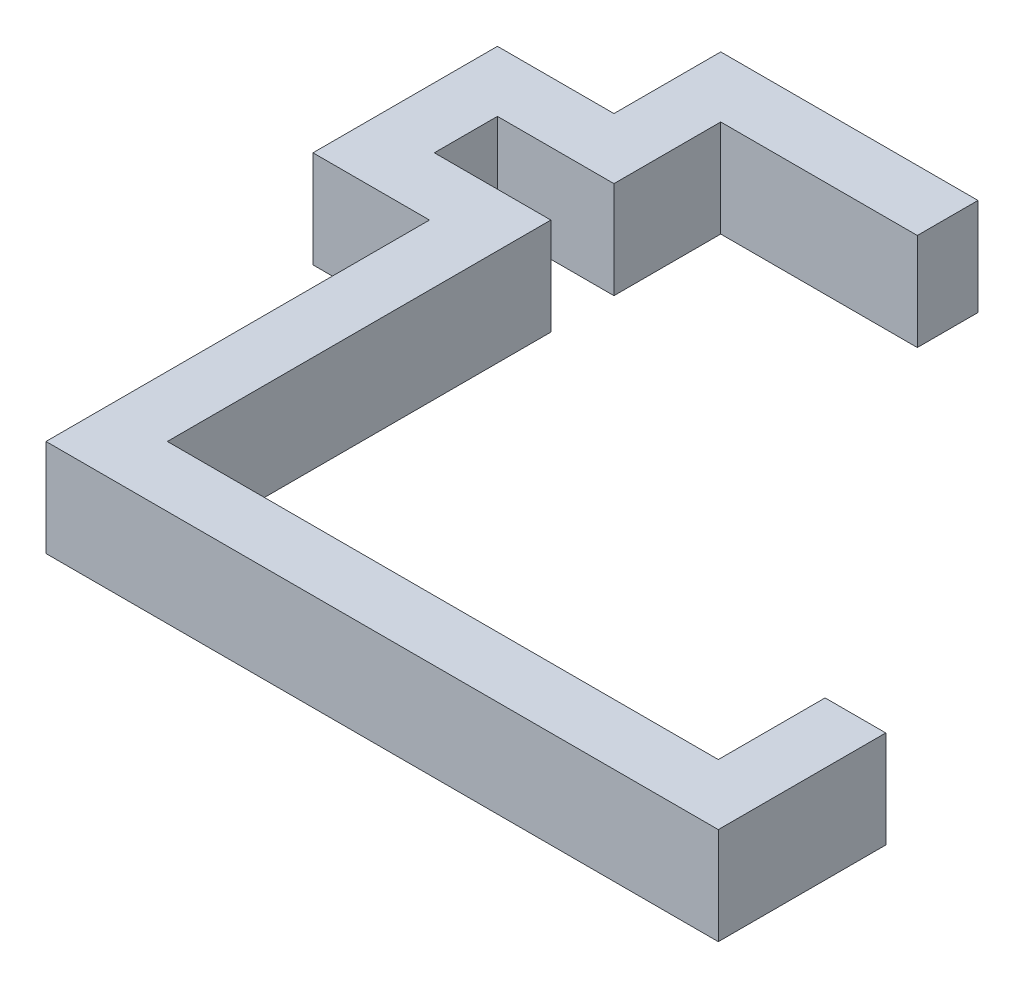
ISO-10303-21;
HEADER;
FILE_DESCRIPTION(('STEP AP214'),'2;1');
FILE_NAME('part.step','',(''),(''),'','','');
FILE_SCHEMA(('AUTOMOTIVE_DESIGN { 1 0 10303 214 1 1 1 1 }'));
ENDSEC;
DATA;
#1=APPLICATION_CONTEXT('core data for automotive mechanical design processes');
#2=APPLICATION_PROTOCOL_DEFINITION('international standard','automotive_design',2000,#1);
#3=PRODUCT_CONTEXT('',#1,'mechanical');
#4=PRODUCT('Part','Part','',(#3));
#5=PRODUCT_RELATED_PRODUCT_CATEGORY('part','',(#4));
#6=PRODUCT_DEFINITION_FORMATION('','',#4);
#7=PRODUCT_DEFINITION_CONTEXT('part definition',#1,'design');
#8=PRODUCT_DEFINITION('design','',#6,#7);
#9=PRODUCT_DEFINITION_SHAPE('','',#8);
#10=(LENGTH_UNIT() NAMED_UNIT(*) SI_UNIT(.MILLI.,.METRE.));
#11=(NAMED_UNIT(*) PLANE_ANGLE_UNIT() SI_UNIT($,.RADIAN.));
#12=(NAMED_UNIT(*) SI_UNIT($,.STERADIAN.) SOLID_ANGLE_UNIT());
#13=UNCERTAINTY_MEASURE_WITH_UNIT(LENGTH_MEASURE(1.E-05),#10,'distance_accuracy_value','');
#14=(GEOMETRIC_REPRESENTATION_CONTEXT(3) GLOBAL_UNCERTAINTY_ASSIGNED_CONTEXT((#13)) GLOBAL_UNIT_ASSIGNED_CONTEXT((#10,
#11,#12)) REPRESENTATION_CONTEXT('',''));
#15=CARTESIAN_POINT('',(0.,0.,0.));
#16=DIRECTION('',(0.,0.,1.));
#17=DIRECTION('',(1.,0.,0.));
#18=AXIS2_PLACEMENT_3D('',#15,#16,#17);
#19=CARTESIAN_POINT('',(0.,4.,-4.4));
#20=DIRECTION('',(1.,0.,0.));
#21=DIRECTION('',(0.,0.,-1.));
#22=AXIS2_PLACEMENT_3D('',#19,#20,#21);
#23=PLANE('',#22);
#24=DIRECTION('',(0.,0.,1.));
#25=VECTOR('',#24,1.);
#26=CARTESIAN_POINT('',(0.,0.,-4.4));
#27=LINE('',#26,#25);
#28=CARTESIAN_POINT('',(0.,0.,-4.4));
#29=VERTEX_POINT('',#28);
#30=CARTESIAN_POINT('',(0.,0.,0.));
#31=VERTEX_POINT('',#30);
#32=EDGE_CURVE('E190',#29,#31,#27,.T.);
#33=ORIENTED_EDGE('',*,*,#32,.T.);
#34=DIRECTION('',(0.,-1.,0.));
#35=VECTOR('',#34,1.);
#36=CARTESIAN_POINT('',(0.,4.,0.));
#37=LINE('',#36,#35);
#38=CARTESIAN_POINT('',(0.,4.,0.));
#39=VERTEX_POINT('',#38);
#40=EDGE_CURVE('E11',#39,#31,#37,.T.);
#41=ORIENTED_EDGE('',*,*,#40,.F.);
#42=DIRECTION('',(0.,0.,1.));
#43=VECTOR('',#42,1.);
#44=CARTESIAN_POINT('',(0.,4.,-4.4));
#45=LINE('',#44,#43);
#46=CARTESIAN_POINT('',(0.,4.,-4.4));
#47=VERTEX_POINT('',#46);
#48=EDGE_CURVE('E224',#47,#39,#45,.T.);
#49=ORIENTED_EDGE('',*,*,#48,.F.);
#50=DIRECTION('',(0.,-1.,0.));
#51=VECTOR('',#50,1.);
#52=CARTESIAN_POINT('',(0.,4.,-4.4));
#53=LINE('',#52,#51);
#54=EDGE_CURVE('E186',#47,#29,#53,.T.);
#55=ORIENTED_EDGE('',*,*,#54,.T.);
#56=EDGE_LOOP('',(#33,#41,#49,#55));
#57=FACE_BOUND('',#56,.T.);
#58=ADVANCED_FACE('F34',(#57),#23,.F.);
#59=CARTESIAN_POINT('',(0.,4.,0.));
#60=DIRECTION('',(0.,0.,1.));
#61=DIRECTION('',(1.,0.,0.));
#62=AXIS2_PLACEMENT_3D('',#59,#60,#61);
#63=PLANE('',#62);
#64=DIRECTION('',(-1.,0.,0.));
#65=VECTOR('',#64,1.);
#66=CARTESIAN_POINT('',(0.,0.,0.));
#67=LINE('',#66,#65);
#68=CARTESIAN_POINT('',(-22.7,0.,0.));
#69=VERTEX_POINT('',#68);
#70=EDGE_CURVE('E193',#31,#69,#67,.T.);
#71=ORIENTED_EDGE('',*,*,#70,.T.);
#72=DIRECTION('',(0.,-1.,0.));
#73=VECTOR('',#72,1.);
#74=CARTESIAN_POINT('',(-22.7,4.,0.));
#75=LINE('',#74,#73);
#76=CARTESIAN_POINT('',(-22.7,4.,0.));
#77=VERTEX_POINT('',#76);
#78=EDGE_CURVE('E42',#77,#69,#75,.T.);
#79=ORIENTED_EDGE('',*,*,#78,.F.);
#80=DIRECTION('',(-1.,0.,0.));
#81=VECTOR('',#80,1.);
#82=CARTESIAN_POINT('',(0.,4.,0.));
#83=LINE('',#82,#81);
#84=EDGE_CURVE('E123',#39,#77,#83,.T.);
#85=ORIENTED_EDGE('',*,*,#84,.F.);
#86=ORIENTED_EDGE('',*,*,#40,.T.);
#87=EDGE_LOOP('',(#71,#79,#85,#86));
#88=FACE_BOUND('',#87,.T.);
#89=ADVANCED_FACE('F332',(#88),#63,.F.);
#90=CARTESIAN_POINT('',(-22.7,4.,0.));
#91=DIRECTION('',(-1.,0.,0.));
#92=DIRECTION('',(0.,0.,1.));
#93=AXIS2_PLACEMENT_3D('',#90,#91,#92);
#94=PLANE('',#93);
#95=DIRECTION('',(0.,0.,-1.));
#96=VECTOR('',#95,1.);
#97=CARTESIAN_POINT('',(-22.7,0.,0.));
#98=LINE('',#97,#96);
#99=CARTESIAN_POINT('',(-22.7,0.,-15.8));
#100=VERTEX_POINT('',#99);
#101=EDGE_CURVE('E195',#69,#100,#98,.T.);
#102=ORIENTED_EDGE('',*,*,#101,.T.);
#103=DIRECTION('',(0.,-1.,0.));
#104=VECTOR('',#103,1.);
#105=CARTESIAN_POINT('',(-22.7,4.,-15.8));
#106=LINE('',#105,#104);
#107=CARTESIAN_POINT('',(-22.7,4.,-15.8));
#108=VERTEX_POINT('',#107);
#109=EDGE_CURVE('E261',#108,#100,#106,.T.);
#110=ORIENTED_EDGE('',*,*,#109,.F.);
#111=DIRECTION('',(0.,0.,-1.));
#112=VECTOR('',#111,1.);
#113=CARTESIAN_POINT('',(-22.7,4.,0.));
#114=LINE('',#113,#112);
#115=EDGE_CURVE('E269',#77,#108,#114,.T.);
#116=ORIENTED_EDGE('',*,*,#115,.F.);
#117=ORIENTED_EDGE('',*,*,#78,.T.);
#118=EDGE_LOOP('',(#102,#110,#116,#117));
#119=FACE_BOUND('',#118,.T.);
#120=ADVANCED_FACE('F267',(#119),#94,.F.);
#121=CARTESIAN_POINT('',(-22.7,4.,-15.8));
#122=DIRECTION('',(0.,0.,1.));
#123=DIRECTION('',(1.,0.,0.));
#124=AXIS2_PLACEMENT_3D('',#121,#122,#123);
#125=PLANE('',#124);
#126=DIRECTION('',(-1.,0.,0.));
#127=VECTOR('',#126,1.);
#128=CARTESIAN_POINT('',(-22.7,0.,-15.8));
#129=LINE('',#128,#127);
#130=CARTESIAN_POINT('',(-27.5,0.,-15.8));
#131=VERTEX_POINT('',#130);
#132=EDGE_CURVE('E197',#100,#131,#129,.T.);
#133=ORIENTED_EDGE('',*,*,#132,.T.);
#134=DIRECTION('',(0.,-1.,0.));
#135=VECTOR('',#134,1.);
#136=CARTESIAN_POINT('',(-27.5,4.,-15.8));
#137=LINE('',#136,#135);
#138=CARTESIAN_POINT('',(-27.5,4.,-15.8));
#139=VERTEX_POINT('',#138);
#140=EDGE_CURVE('E258',#139,#131,#137,.T.);
#141=ORIENTED_EDGE('',*,*,#140,.F.);
#142=DIRECTION('',(-1.,0.,0.));
#143=VECTOR('',#142,1.);
#144=CARTESIAN_POINT('',(-22.7,4.,-15.8));
#145=LINE('',#144,#143);
#146=EDGE_CURVE('E287',#108,#139,#145,.T.);
#147=ORIENTED_EDGE('',*,*,#146,.F.);
#148=ORIENTED_EDGE('',*,*,#109,.T.);
#149=EDGE_LOOP('',(#133,#141,#147,#148));
#150=FACE_BOUND('',#149,.T.);
#151=ADVANCED_FACE('F278',(#150),#125,.F.);
#152=CARTESIAN_POINT('',(-27.5,4.,-15.8));
#153=DIRECTION('',(-1.,0.,0.));
#154=DIRECTION('',(0.,0.,1.));
#155=AXIS2_PLACEMENT_3D('',#152,#153,#154);
#156=PLANE('',#155);
#157=DIRECTION('',(0.,0.,-1.));
#158=VECTOR('',#157,1.);
#159=CARTESIAN_POINT('',(-27.5,0.,-15.8));
#160=LINE('',#159,#158);
#161=CARTESIAN_POINT('',(-27.5,0.,-18.4));
#162=VERTEX_POINT('',#161);
#163=EDGE_CURVE('E199',#131,#162,#160,.T.);
#164=ORIENTED_EDGE('',*,*,#163,.T.);
#165=DIRECTION('',(0.,-1.,0.));
#166=VECTOR('',#165,1.);
#167=CARTESIAN_POINT('',(-27.5,4.,-18.4));
#168=LINE('',#167,#166);
#169=CARTESIAN_POINT('',(-27.5,4.,-18.4));
#170=VERTEX_POINT('',#169);
#171=EDGE_CURVE('E255',#170,#162,#168,.T.);
#172=ORIENTED_EDGE('',*,*,#171,.F.);
#173=DIRECTION('',(0.,0.,-1.));
#174=VECTOR('',#173,1.);
#175=CARTESIAN_POINT('',(-27.5,4.,-15.8));
#176=LINE('',#175,#174);
#177=EDGE_CURVE('E284',#139,#170,#176,.T.);
#178=ORIENTED_EDGE('',*,*,#177,.F.);
#179=ORIENTED_EDGE('',*,*,#140,.T.);
#180=EDGE_LOOP('',(#164,#172,#178,#179));
#181=FACE_BOUND('',#180,.T.);
#182=ADVANCED_FACE('F282',(#181),#156,.F.);
#183=CARTESIAN_POINT('',(-27.5,4.,-18.4));
#184=DIRECTION('',(0.,0.,-1.));
#185=DIRECTION('',(-1.,0.,0.));
#186=AXIS2_PLACEMENT_3D('',#183,#184,#185);
#187=PLANE('',#186);
#188=DIRECTION('',(1.,0.,0.));
#189=VECTOR('',#188,1.);
#190=CARTESIAN_POINT('',(-27.5,0.,-18.4));
#191=LINE('',#190,#189);
#192=CARTESIAN_POINT('',(-22.7,0.,-18.4));
#193=VERTEX_POINT('',#192);
#194=EDGE_CURVE('E201',#162,#193,#191,.T.);
#195=ORIENTED_EDGE('',*,*,#194,.T.);
#196=DIRECTION('',(0.,-1.,0.));
#197=VECTOR('',#196,1.);
#198=CARTESIAN_POINT('',(-22.7,4.,-18.4));
#199=LINE('',#198,#197);
#200=CARTESIAN_POINT('',(-22.7,4.,-18.4));
#201=VERTEX_POINT('',#200);
#202=EDGE_CURVE('E252',#201,#193,#199,.T.);
#203=ORIENTED_EDGE('',*,*,#202,.F.);
#204=DIRECTION('',(1.,0.,0.));
#205=VECTOR('',#204,1.);
#206=CARTESIAN_POINT('',(-27.5,4.,-18.4));
#207=LINE('',#206,#205);
#208=EDGE_CURVE('E286',#170,#201,#207,.T.);
#209=ORIENTED_EDGE('',*,*,#208,.F.);
#210=ORIENTED_EDGE('',*,*,#171,.T.);
#211=EDGE_LOOP('',(#195,#203,#209,#210));
#212=FACE_BOUND('',#211,.T.);
#213=ADVANCED_FACE('F345',(#212),#187,.F.);
#214=CARTESIAN_POINT('',(-22.7,4.,-18.4));
#215=DIRECTION('',(-1.,0.,0.));
#216=DIRECTION('',(0.,0.,1.));
#217=AXIS2_PLACEMENT_3D('',#214,#215,#216);
#218=PLANE('',#217);
#219=DIRECTION('',(0.,0.,-1.));
#220=VECTOR('',#219,1.);
#221=CARTESIAN_POINT('',(-22.7,0.,-18.4));
#222=LINE('',#221,#220);
#223=CARTESIAN_POINT('',(-22.7,0.,-22.8));
#224=VERTEX_POINT('',#223);
#225=EDGE_CURVE('E203',#193,#224,#222,.T.);
#226=ORIENTED_EDGE('',*,*,#225,.T.);
#227=DIRECTION('',(0.,-1.,0.));
#228=VECTOR('',#227,1.);
#229=CARTESIAN_POINT('',(-22.7,4.,-22.8));
#230=LINE('',#229,#228);
#231=CARTESIAN_POINT('',(-22.7,4.,-22.8));
#232=VERTEX_POINT('',#231);
#233=EDGE_CURVE('E249',#232,#224,#230,.T.);
#234=ORIENTED_EDGE('',*,*,#233,.F.);
#235=DIRECTION('',(0.,0.,-1.));
#236=VECTOR('',#235,1.);
#237=CARTESIAN_POINT('',(-22.7,4.,-18.4));
#238=LINE('',#237,#236);
#239=EDGE_CURVE('E289',#201,#232,#238,.T.);
#240=ORIENTED_EDGE('',*,*,#239,.F.);
#241=ORIENTED_EDGE('',*,*,#202,.T.);
#242=EDGE_LOOP('',(#226,#234,#240,#241));
#243=FACE_BOUND('',#242,.T.);
#244=ADVANCED_FACE('F348',(#243),#218,.F.);
#245=CARTESIAN_POINT('',(-22.7,4.,-22.8));
#246=DIRECTION('',(0.,0.,-1.));
#247=DIRECTION('',(-1.,0.,0.));
#248=AXIS2_PLACEMENT_3D('',#245,#246,#247);
#249=PLANE('',#248);
#250=DIRECTION('',(1.,0.,0.));
#251=VECTOR('',#250,1.);
#252=CARTESIAN_POINT('',(-22.7,0.,-22.8));
#253=LINE('',#252,#251);
#254=CARTESIAN_POINT('',(-14.6,0.,-22.8));
#255=VERTEX_POINT('',#254);
#256=EDGE_CURVE('E205',#224,#255,#253,.T.);
#257=ORIENTED_EDGE('',*,*,#256,.T.);
#258=DIRECTION('',(0.,-1.,0.));
#259=VECTOR('',#258,1.);
#260=CARTESIAN_POINT('',(-14.6,4.,-22.8));
#261=LINE('',#260,#259);
#262=CARTESIAN_POINT('',(-14.6,4.,-22.8));
#263=VERTEX_POINT('',#262);
#264=EDGE_CURVE('E246',#263,#255,#261,.T.);
#265=ORIENTED_EDGE('',*,*,#264,.F.);
#266=DIRECTION('',(1.,0.,0.));
#267=VECTOR('',#266,1.);
#268=CARTESIAN_POINT('',(-22.7,4.,-22.8));
#269=LINE('',#268,#267);
#270=EDGE_CURVE('E295',#232,#263,#269,.T.);
#271=ORIENTED_EDGE('',*,*,#270,.F.);
#272=ORIENTED_EDGE('',*,*,#233,.T.);
#273=EDGE_LOOP('',(#257,#265,#271,#272));
#274=FACE_BOUND('',#273,.T.);
#275=ADVANCED_FACE('F352',(#274),#249,.F.);
#276=CARTESIAN_POINT('',(-14.6,4.,-22.8));
#277=DIRECTION('',(-1.,0.,0.));
#278=DIRECTION('',(0.,0.,1.));
#279=AXIS2_PLACEMENT_3D('',#276,#277,#278);
#280=PLANE('',#279);
#281=DIRECTION('',(0.,0.,-1.));
#282=VECTOR('',#281,1.);
#283=CARTESIAN_POINT('',(-14.6,0.,-22.8));
#284=LINE('',#283,#282);
#285=CARTESIAN_POINT('',(-14.6,0.,-25.3));
#286=VERTEX_POINT('',#285);
#287=EDGE_CURVE('E207',#255,#286,#284,.T.);
#288=ORIENTED_EDGE('',*,*,#287,.T.);
#289=DIRECTION('',(0.,-1.,0.));
#290=VECTOR('',#289,1.);
#291=CARTESIAN_POINT('',(-14.6,4.,-25.3));
#292=LINE('',#291,#290);
#293=CARTESIAN_POINT('',(-14.6,4.,-25.3));
#294=VERTEX_POINT('',#293);
#295=EDGE_CURVE('E243',#294,#286,#292,.T.);
#296=ORIENTED_EDGE('',*,*,#295,.F.);
#297=DIRECTION('',(0.,0.,-1.));
#298=VECTOR('',#297,1.);
#299=CARTESIAN_POINT('',(-14.6,4.,-22.8));
#300=LINE('',#299,#298);
#301=EDGE_CURVE('E297',#263,#294,#300,.T.);
#302=ORIENTED_EDGE('',*,*,#301,.F.);
#303=ORIENTED_EDGE('',*,*,#264,.T.);
#304=EDGE_LOOP('',(#288,#296,#302,#303));
#305=FACE_BOUND('',#304,.T.);
#306=ADVANCED_FACE('F356',(#305),#280,.F.);
#307=CARTESIAN_POINT('',(-14.6,4.,-25.3));
#308=DIRECTION('',(0.,0.,1.));
#309=DIRECTION('',(1.,0.,0.));
#310=AXIS2_PLACEMENT_3D('',#307,#308,#309);
#311=PLANE('',#310);
#312=DIRECTION('',(-1.,0.,0.));
#313=VECTOR('',#312,1.);
#314=CARTESIAN_POINT('',(-14.6,0.,-25.3));
#315=LINE('',#314,#313);
#316=CARTESIAN_POINT('',(-25.2,0.,-25.3));
#317=VERTEX_POINT('',#316);
#318=EDGE_CURVE('E209',#286,#317,#315,.T.);
#319=ORIENTED_EDGE('',*,*,#318,.T.);
#320=DIRECTION('',(0.,-1.,0.));
#321=VECTOR('',#320,1.);
#322=CARTESIAN_POINT('',(-25.2,4.,-25.3));
#323=LINE('',#322,#321);
#324=CARTESIAN_POINT('',(-25.2,4.,-25.3));
#325=VERTEX_POINT('',#324);
#326=EDGE_CURVE('E240',#325,#317,#323,.T.);
#327=ORIENTED_EDGE('',*,*,#326,.F.);
#328=DIRECTION('',(-1.,0.,0.));
#329=VECTOR('',#328,1.);
#330=CARTESIAN_POINT('',(-14.6,4.,-25.3));
#331=LINE('',#330,#329);
#332=EDGE_CURVE('E299',#294,#325,#331,.T.);
#333=ORIENTED_EDGE('',*,*,#332,.F.);
#334=ORIENTED_EDGE('',*,*,#295,.T.);
#335=EDGE_LOOP('',(#319,#327,#333,#334));
#336=FACE_BOUND('',#335,.T.);
#337=ADVANCED_FACE('F360',(#336),#311,.F.);
#338=CARTESIAN_POINT('',(-25.2,4.,-25.3));
#339=DIRECTION('',(1.,0.,0.));
#340=DIRECTION('',(0.,0.,-1.));
#341=AXIS2_PLACEMENT_3D('',#338,#339,#340);
#342=PLANE('',#341);
#343=DIRECTION('',(0.,0.,1.));
#344=VECTOR('',#343,1.);
#345=CARTESIAN_POINT('',(-25.2,0.,-25.3));
#346=LINE('',#345,#344);
#347=CARTESIAN_POINT('',(-25.2,0.,-20.9));
#348=VERTEX_POINT('',#347);
#349=EDGE_CURVE('E211',#317,#348,#346,.T.);
#350=ORIENTED_EDGE('',*,*,#349,.T.);
#351=DIRECTION('',(0.,-1.,0.));
#352=VECTOR('',#351,1.);
#353=CARTESIAN_POINT('',(-25.2,4.,-20.9));
#354=LINE('',#353,#352);
#355=CARTESIAN_POINT('',(-25.2,4.,-20.9));
#356=VERTEX_POINT('',#355);
#357=EDGE_CURVE('E237',#356,#348,#354,.T.);
#358=ORIENTED_EDGE('',*,*,#357,.F.);
#359=DIRECTION('',(0.,0.,1.));
#360=VECTOR('',#359,1.);
#361=CARTESIAN_POINT('',(-25.2,4.,-25.3));
#362=LINE('',#361,#360);
#363=EDGE_CURVE('E301',#325,#356,#362,.T.);
#364=ORIENTED_EDGE('',*,*,#363,.F.);
#365=ORIENTED_EDGE('',*,*,#326,.T.);
#366=EDGE_LOOP('',(#350,#358,#364,#365));
#367=FACE_BOUND('',#366,.T.);
#368=ADVANCED_FACE('F364',(#367),#342,.F.);
#369=CARTESIAN_POINT('',(-25.2,4.,-20.9));
#370=DIRECTION('',(0.,0.,1.));
#371=DIRECTION('',(1.,0.,0.));
#372=AXIS2_PLACEMENT_3D('',#369,#370,#371);
#373=PLANE('',#372);
#374=DIRECTION('',(-1.,0.,0.));
#375=VECTOR('',#374,1.);
#376=CARTESIAN_POINT('',(-25.2,0.,-20.9));
#377=LINE('',#376,#375);
#378=CARTESIAN_POINT('',(-30.,0.,-20.9));
#379=VERTEX_POINT('',#378);
#380=EDGE_CURVE('E213',#348,#379,#377,.T.);
#381=ORIENTED_EDGE('',*,*,#380,.T.);
#382=DIRECTION('',(0.,-1.,0.));
#383=VECTOR('',#382,1.);
#384=CARTESIAN_POINT('',(-30.,4.,-20.9));
#385=LINE('',#384,#383);
#386=CARTESIAN_POINT('',(-30.,4.,-20.9));
#387=VERTEX_POINT('',#386);
#388=EDGE_CURVE('E234',#387,#379,#385,.T.);
#389=ORIENTED_EDGE('',*,*,#388,.F.);
#390=DIRECTION('',(-1.,0.,0.));
#391=VECTOR('',#390,1.);
#392=CARTESIAN_POINT('',(-25.2,4.,-20.9));
#393=LINE('',#392,#391);
#394=EDGE_CURVE('E303',#356,#387,#393,.T.);
#395=ORIENTED_EDGE('',*,*,#394,.F.);
#396=ORIENTED_EDGE('',*,*,#357,.T.);
#397=EDGE_LOOP('',(#381,#389,#395,#396));
#398=FACE_BOUND('',#397,.T.);
#399=ADVANCED_FACE('F368',(#398),#373,.F.);
#400=CARTESIAN_POINT('',(-30.,4.,-20.9));
#401=DIRECTION('',(1.,0.,0.));
#402=DIRECTION('',(0.,0.,-1.));
#403=AXIS2_PLACEMENT_3D('',#400,#401,#402);
#404=PLANE('',#403);
#405=DIRECTION('',(0.,0.,1.));
#406=VECTOR('',#405,1.);
#407=CARTESIAN_POINT('',(-30.,0.,-20.9));
#408=LINE('',#407,#406);
#409=CARTESIAN_POINT('',(-30.,0.,-13.3));
#410=VERTEX_POINT('',#409);
#411=EDGE_CURVE('E215',#379,#410,#408,.T.);
#412=ORIENTED_EDGE('',*,*,#411,.T.);
#413=DIRECTION('',(0.,-1.,0.));
#414=VECTOR('',#413,1.);
#415=CARTESIAN_POINT('',(-30.,4.,-13.3));
#416=LINE('',#415,#414);
#417=CARTESIAN_POINT('',(-30.,4.,-13.3));
#418=VERTEX_POINT('',#417);
#419=EDGE_CURVE('E231',#418,#410,#416,.T.);
#420=ORIENTED_EDGE('',*,*,#419,.F.);
#421=DIRECTION('',(0.,0.,1.));
#422=VECTOR('',#421,1.);
#423=CARTESIAN_POINT('',(-30.,4.,-20.9));
#424=LINE('',#423,#422);
#425=EDGE_CURVE('E305',#387,#418,#424,.T.);
#426=ORIENTED_EDGE('',*,*,#425,.F.);
#427=ORIENTED_EDGE('',*,*,#388,.T.);
#428=EDGE_LOOP('',(#412,#420,#426,#427));
#429=FACE_BOUND('',#428,.T.);
#430=ADVANCED_FACE('F372',(#429),#404,.F.);
#431=CARTESIAN_POINT('',(-30.,4.,-13.3));
#432=DIRECTION('',(0.,0.,-1.));
#433=DIRECTION('',(-1.,0.,0.));
#434=AXIS2_PLACEMENT_3D('',#431,#432,#433);
#435=PLANE('',#434);
#436=DIRECTION('',(1.,0.,0.));
#437=VECTOR('',#436,1.);
#438=CARTESIAN_POINT('',(-30.,0.,-13.3));
#439=LINE('',#438,#437);
#440=CARTESIAN_POINT('',(-25.2,0.,-13.3));
#441=VERTEX_POINT('',#440);
#442=EDGE_CURVE('E217',#410,#441,#439,.T.);
#443=ORIENTED_EDGE('',*,*,#442,.T.);
#444=DIRECTION('',(0.,-1.,0.));
#445=VECTOR('',#444,1.);
#446=CARTESIAN_POINT('',(-25.2,4.,-13.3));
#447=LINE('',#446,#445);
#448=CARTESIAN_POINT('',(-25.2,4.,-13.3));
#449=VERTEX_POINT('',#448);
#450=EDGE_CURVE('E228',#449,#441,#447,.T.);
#451=ORIENTED_EDGE('',*,*,#450,.F.);
#452=DIRECTION('',(1.,0.,0.));
#453=VECTOR('',#452,1.);
#454=CARTESIAN_POINT('',(-30.,4.,-13.3));
#455=LINE('',#454,#453);
#456=EDGE_CURVE('E307',#418,#449,#455,.T.);
#457=ORIENTED_EDGE('',*,*,#456,.F.);
#458=ORIENTED_EDGE('',*,*,#419,.T.);
#459=EDGE_LOOP('',(#443,#451,#457,#458));
#460=FACE_BOUND('',#459,.T.);
#461=ADVANCED_FACE('F313',(#460),#435,.F.);
#462=CARTESIAN_POINT('',(-25.2,4.,-13.3));
#463=DIRECTION('',(1.,0.,0.));
#464=DIRECTION('',(0.,0.,-1.));
#465=AXIS2_PLACEMENT_3D('',#462,#463,#464);
#466=PLANE('',#465);
#467=DIRECTION('',(0.,0.,1.));
#468=VECTOR('',#467,1.);
#469=CARTESIAN_POINT('',(-25.2,0.,-13.3));
#470=LINE('',#469,#468);
#471=CARTESIAN_POINT('',(-25.2,0.,2.5));
#472=VERTEX_POINT('',#471);
#473=EDGE_CURVE('E219',#441,#472,#470,.T.);
#474=ORIENTED_EDGE('',*,*,#473,.T.);
#475=DIRECTION('',(0.,-1.,0.));
#476=VECTOR('',#475,1.);
#477=CARTESIAN_POINT('',(-25.2,4.,2.5));
#478=LINE('',#477,#476);
#479=CARTESIAN_POINT('',(-25.2,4.,2.5));
#480=VERTEX_POINT('',#479);
#481=EDGE_CURVE('E181',#480,#472,#478,.T.);
#482=ORIENTED_EDGE('',*,*,#481,.F.);
#483=DIRECTION('',(0.,0.,1.));
#484=VECTOR('',#483,1.);
#485=CARTESIAN_POINT('',(-25.2,4.,-13.3));
#486=LINE('',#485,#484);
#487=EDGE_CURVE('E172',#449,#480,#486,.T.);
#488=ORIENTED_EDGE('',*,*,#487,.F.);
#489=ORIENTED_EDGE('',*,*,#450,.T.);
#490=EDGE_LOOP('',(#474,#482,#488,#489));
#491=FACE_BOUND('',#490,.T.);
#492=ADVANCED_FACE('F317',(#491),#466,.F.);
#493=CARTESIAN_POINT('',(-25.2,4.,2.5));
#494=DIRECTION('',(0.,0.,-1.));
#495=DIRECTION('',(-1.,0.,0.));
#496=AXIS2_PLACEMENT_3D('',#493,#494,#495);
#497=PLANE('',#496);
#498=DIRECTION('',(1.,0.,0.));
#499=VECTOR('',#498,1.);
#500=CARTESIAN_POINT('',(-25.2,0.,2.5));
#501=LINE('',#500,#499);
#502=CARTESIAN_POINT('',(2.5,0.,2.5));
#503=VERTEX_POINT('',#502);
#504=EDGE_CURVE('E180',#472,#503,#501,.T.);
#505=ORIENTED_EDGE('',*,*,#504,.T.);
#506=DIRECTION('',(0.,-1.,0.));
#507=VECTOR('',#506,1.);
#508=CARTESIAN_POINT('',(2.5,4.,2.5));
#509=LINE('',#508,#507);
#510=CARTESIAN_POINT('',(2.5,4.,2.5));
#511=VERTEX_POINT('',#510);
#512=EDGE_CURVE('E177',#511,#503,#509,.T.);
#513=ORIENTED_EDGE('',*,*,#512,.F.);
#514=DIRECTION('',(1.,0.,0.));
#515=VECTOR('',#514,1.);
#516=CARTESIAN_POINT('',(-25.2,4.,2.5));
#517=LINE('',#516,#515);
#518=EDGE_CURVE('E166',#480,#511,#517,.T.);
#519=ORIENTED_EDGE('',*,*,#518,.F.);
#520=ORIENTED_EDGE('',*,*,#481,.T.);
#521=EDGE_LOOP('',(#505,#513,#519,#520));
#522=FACE_BOUND('',#521,.T.);
#523=ADVANCED_FACE('F178',(#522),#497,.F.);
#524=CARTESIAN_POINT('',(2.5,4.,2.5));
#525=DIRECTION('',(-1.,0.,0.));
#526=DIRECTION('',(0.,0.,1.));
#527=AXIS2_PLACEMENT_3D('',#524,#525,#526);
#528=PLANE('',#527);
#529=DIRECTION('',(0.,0.,-1.));
#530=VECTOR('',#529,1.);
#531=CARTESIAN_POINT('',(2.5,0.,2.5));
#532=LINE('',#531,#530);
#533=CARTESIAN_POINT('',(2.5,0.,-4.4));
#534=VERTEX_POINT('',#533);
#535=EDGE_CURVE('E109',#503,#534,#532,.T.);
#536=ORIENTED_EDGE('',*,*,#535,.T.);
#537=DIRECTION('',(0.,-1.,0.));
#538=VECTOR('',#537,1.);
#539=CARTESIAN_POINT('',(2.5,4.,-4.4));
#540=LINE('',#539,#538);
#541=CARTESIAN_POINT('',(2.5,4.,-4.4));
#542=VERTEX_POINT('',#541);
#543=EDGE_CURVE('E182',#542,#534,#540,.T.);
#544=ORIENTED_EDGE('',*,*,#543,.F.);
#545=DIRECTION('',(0.,0.,-1.));
#546=VECTOR('',#545,1.);
#547=CARTESIAN_POINT('',(2.5,4.,2.5));
#548=LINE('',#547,#546);
#549=EDGE_CURVE('E170',#511,#542,#548,.T.);
#550=ORIENTED_EDGE('',*,*,#549,.F.);
#551=ORIENTED_EDGE('',*,*,#512,.T.);
#552=EDGE_LOOP('',(#536,#544,#550,#551));
#553=FACE_BOUND('',#552,.T.);
#554=ADVANCED_FACE('F184',(#553),#528,.F.);
#555=CARTESIAN_POINT('',(2.5,4.,-4.4));
#556=DIRECTION('',(0.,0.,1.));
#557=DIRECTION('',(1.,0.,0.));
#558=AXIS2_PLACEMENT_3D('',#555,#556,#557);
#559=PLANE('',#558);
#560=DIRECTION('',(-1.,0.,0.));
#561=VECTOR('',#560,1.);
#562=CARTESIAN_POINT('',(2.5,0.,-4.4));
#563=LINE('',#562,#561);
#564=EDGE_CURVE('E115',#534,#29,#563,.T.);
#565=ORIENTED_EDGE('',*,*,#564,.T.);
#566=ORIENTED_EDGE('',*,*,#54,.F.);
#567=DIRECTION('',(-1.,0.,0.));
#568=VECTOR('',#567,1.);
#569=CARTESIAN_POINT('',(2.5,4.,-4.4));
#570=LINE('',#569,#568);
#571=EDGE_CURVE('E50',#542,#47,#570,.T.);
#572=ORIENTED_EDGE('',*,*,#571,.F.);
#573=ORIENTED_EDGE('',*,*,#543,.T.);
#574=EDGE_LOOP('',(#565,#566,#572,#573));
#575=FACE_BOUND('',#574,.T.);
#576=ADVANCED_FACE('F321',(#575),#559,.F.);
#577=CARTESIAN_POINT('',(0.,4.,0.));
#578=DIRECTION('',(0.,-1.,0.));
#579=DIRECTION('',(0.,0.,-1.));
#580=AXIS2_PLACEMENT_3D('',#577,#578,#579);
#581=PLANE('',#580);
#582=ORIENTED_EDGE('',*,*,#48,.T.);
#583=ORIENTED_EDGE('',*,*,#84,.T.);
#584=ORIENTED_EDGE('',*,*,#115,.T.);
#585=ORIENTED_EDGE('',*,*,#146,.T.);
#586=ORIENTED_EDGE('',*,*,#177,.T.);
#587=ORIENTED_EDGE('',*,*,#208,.T.);
#588=ORIENTED_EDGE('',*,*,#239,.T.);
#589=ORIENTED_EDGE('',*,*,#270,.T.);
#590=ORIENTED_EDGE('',*,*,#301,.T.);
#591=ORIENTED_EDGE('',*,*,#332,.T.);
#592=ORIENTED_EDGE('',*,*,#363,.T.);
#593=ORIENTED_EDGE('',*,*,#394,.T.);
#594=ORIENTED_EDGE('',*,*,#425,.T.);
#595=ORIENTED_EDGE('',*,*,#456,.T.);
#596=ORIENTED_EDGE('',*,*,#487,.T.);
#597=ORIENTED_EDGE('',*,*,#518,.T.);
#598=ORIENTED_EDGE('',*,*,#549,.T.);
#599=ORIENTED_EDGE('',*,*,#571,.T.);
#600=EDGE_LOOP('',(#582,#583,#584,#585,#586,#587,#588,#589,#590,#591,#592,#593,#594,#595,#596,
#597,#598,#599));
#601=FACE_BOUND('',#600,.T.);
#602=ADVANCED_FACE('F168',(#601),#581,.F.);
#603=CARTESIAN_POINT('',(0.,0.,0.));
#604=DIRECTION('',(0.,-1.,0.));
#605=DIRECTION('',(0.,0.,-1.));
#606=AXIS2_PLACEMENT_3D('',#603,#604,#605);
#607=PLANE('',#606);
#608=ORIENTED_EDGE('',*,*,#32,.F.);
#609=ORIENTED_EDGE('',*,*,#564,.F.);
#610=ORIENTED_EDGE('',*,*,#535,.F.);
#611=ORIENTED_EDGE('',*,*,#504,.F.);
#612=ORIENTED_EDGE('',*,*,#473,.F.);
#613=ORIENTED_EDGE('',*,*,#442,.F.);
#614=ORIENTED_EDGE('',*,*,#411,.F.);
#615=ORIENTED_EDGE('',*,*,#380,.F.);
#616=ORIENTED_EDGE('',*,*,#349,.F.);
#617=ORIENTED_EDGE('',*,*,#318,.F.);
#618=ORIENTED_EDGE('',*,*,#287,.F.);
#619=ORIENTED_EDGE('',*,*,#256,.F.);
#620=ORIENTED_EDGE('',*,*,#225,.F.);
#621=ORIENTED_EDGE('',*,*,#194,.F.);
#622=ORIENTED_EDGE('',*,*,#163,.F.);
#623=ORIENTED_EDGE('',*,*,#132,.F.);
#624=ORIENTED_EDGE('',*,*,#101,.F.);
#625=ORIENTED_EDGE('',*,*,#70,.F.);
#626=EDGE_LOOP('',(#608,#609,#610,#611,#612,#613,#614,#615,#616,#617,#618,#619,#620,#621,#622,
#623,#624,#625));
#627=FACE_BOUND('',#626,.T.);
#628=ADVANCED_FACE('F273',(#627),#607,.T.);
#629=CLOSED_SHELL('',(#58,#89,#120,#151,#182,#213,#244,#275,#306,#337,#368,#399,#430,#461,#492,
#523,#554,#576,#602,#628));
#630=MANIFOLD_SOLID_BREP('B2',#629);
#631=ADVANCED_BREP_SHAPE_REPRESENTATION('',(#18,#630),#14);
#632=SHAPE_DEFINITION_REPRESENTATION(#9,#631);
ENDSEC;
END-ISO-10303-21;
